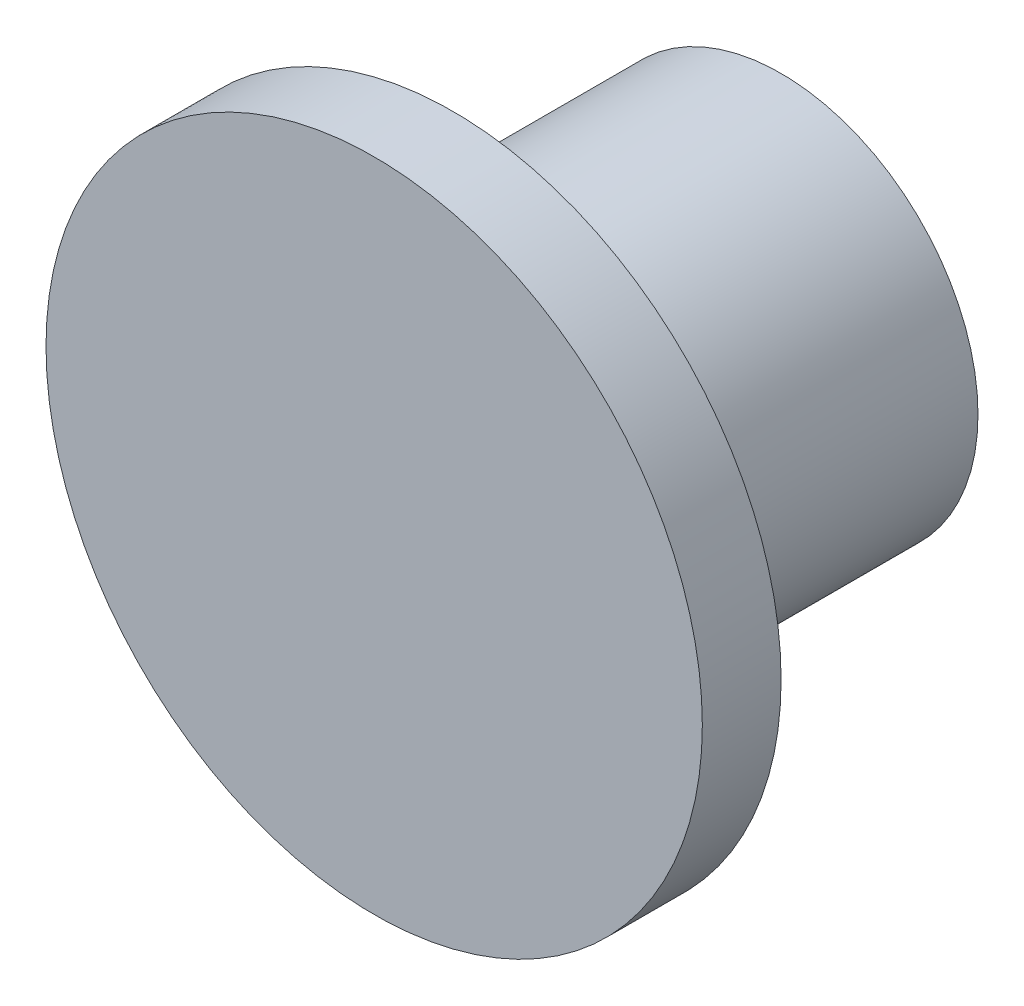
ISO-10303-21;
HEADER;
FILE_DESCRIPTION(('STEP AP214'),'2;1');
FILE_NAME('part.step','',(''),(''),'','','');
FILE_SCHEMA(('AUTOMOTIVE_DESIGN { 1 0 10303 214 1 1 1 1 }'));
ENDSEC;
DATA;
#1=APPLICATION_CONTEXT('core data for automotive mechanical design processes');
#2=APPLICATION_PROTOCOL_DEFINITION('international standard','automotive_design',2000,#1);
#3=PRODUCT_CONTEXT('',#1,'mechanical');
#4=PRODUCT('Part','Part','',(#3));
#5=PRODUCT_RELATED_PRODUCT_CATEGORY('part','',(#4));
#6=PRODUCT_DEFINITION_FORMATION('','',#4);
#7=PRODUCT_DEFINITION_CONTEXT('part definition',#1,'design');
#8=PRODUCT_DEFINITION('design','',#6,#7);
#9=PRODUCT_DEFINITION_SHAPE('','',#8);
#10=(LENGTH_UNIT() NAMED_UNIT(*) SI_UNIT(.MILLI.,.METRE.));
#11=(NAMED_UNIT(*) PLANE_ANGLE_UNIT() SI_UNIT($,.RADIAN.));
#12=(NAMED_UNIT(*) SI_UNIT($,.STERADIAN.) SOLID_ANGLE_UNIT());
#13=UNCERTAINTY_MEASURE_WITH_UNIT(LENGTH_MEASURE(1.E-05),#10,'distance_accuracy_value','');
#14=(GEOMETRIC_REPRESENTATION_CONTEXT(3) GLOBAL_UNCERTAINTY_ASSIGNED_CONTEXT((#13)) GLOBAL_UNIT_ASSIGNED_CONTEXT((#10,
#11,#12)) REPRESENTATION_CONTEXT('',''));
#15=CARTESIAN_POINT('',(0.,0.,0.));
#16=DIRECTION('',(0.,0.,1.));
#17=DIRECTION('',(1.,0.,0.));
#18=AXIS2_PLACEMENT_3D('',#15,#16,#17);
#19=CARTESIAN_POINT('',(0.,0.,31.75));
#20=DIRECTION('',(0.,0.,-1.));
#21=DIRECTION('',(-1.,0.,0.));
#22=AXIS2_PLACEMENT_3D('',#19,#20,#21);
#23=CYLINDRICAL_SURFACE('',#22,19.05);
#24=CARTESIAN_POINT('',(0.,0.,31.75));
#25=DIRECTION('',(0.,0.,1.));
#26=DIRECTION('',(1.,0.,0.));
#27=AXIS2_PLACEMENT_3D('',#24,#25,#26);
#28=CIRCLE('',#27,19.05);
#29=CARTESIAN_POINT('',(19.05,0.,31.75));
#30=VERTEX_POINT('',#29);
#31=EDGE_CURVE('E10',#30,#30,#28,.T.);
#32=ORIENTED_EDGE('',*,*,#31,.F.);
#33=EDGE_LOOP('',(#32));
#34=FACE_BOUND('',#33,.T.);
#35=CARTESIAN_POINT('',(0.,0.,0.));
#36=DIRECTION('',(0.,0.,1.));
#37=DIRECTION('',(1.,0.,0.));
#38=AXIS2_PLACEMENT_3D('',#35,#36,#37);
#39=CIRCLE('',#38,19.05);
#40=CARTESIAN_POINT('',(19.05,0.,0.));
#41=VERTEX_POINT('',#40);
#42=EDGE_CURVE('E37',#41,#41,#39,.T.);
#43=ORIENTED_EDGE('',*,*,#42,.T.);
#44=EDGE_LOOP('',(#43));
#45=FACE_BOUND('',#44,.T.);
#46=ADVANCED_FACE('F34',(#34,#45),#23,.T.);
#47=CARTESIAN_POINT('',(0.,0.,0.));
#48=DIRECTION('',(0.,0.,1.));
#49=DIRECTION('',(1.,0.,0.));
#50=AXIS2_PLACEMENT_3D('',#47,#48,#49);
#51=PLANE('',#50);
#52=ORIENTED_EDGE('',*,*,#42,.F.);
#53=EDGE_LOOP('',(#52));
#54=FACE_BOUND('',#53,.T.);
#55=ADVANCED_FACE('F57',(#54),#51,.F.);
#56=CARTESIAN_POINT('',(0.,0.,39.37));
#57=DIRECTION('',(0.,0.,-1.));
#58=DIRECTION('',(-1.,0.,0.));
#59=AXIS2_PLACEMENT_3D('',#56,#57,#58);
#60=CYLINDRICAL_SURFACE('',#59,31.75);
#61=CARTESIAN_POINT('',(0.,0.,39.37));
#62=DIRECTION('',(0.,0.,1.));
#63=DIRECTION('',(1.,0.,0.));
#64=AXIS2_PLACEMENT_3D('',#61,#62,#63);
#65=CIRCLE('',#64,31.75);
#66=CARTESIAN_POINT('',(-31.75,0.,39.37));
#67=VERTEX_POINT('',#66);
#68=EDGE_CURVE('E44',#67,#67,#65,.T.);
#69=CARTESIAN_POINT('',(0.,0.,31.75));
#70=DIRECTION('',(0.,0.,1.));
#71=DIRECTION('',(1.,0.,0.));
#72=AXIS2_PLACEMENT_3D('',#69,#70,#71);
#73=CIRCLE('',#72,31.75);
#74=CARTESIAN_POINT('',(-31.75,0.,31.75));
#75=VERTEX_POINT('',#74);
#76=EDGE_CURVE('E46',#75,#75,#73,.T.);
#77=CARTESIAN_POINT('',(-31.75,0.,39.37));
#78=CARTESIAN_POINT('',(-31.75,0.,39.290625));
#79=CARTESIAN_POINT('',(-31.75,0.,39.21125));
#80=CARTESIAN_POINT('',(-31.75,0.,39.0525));
#81=CARTESIAN_POINT('',(-31.75,0.,38.973125));
#82=CARTESIAN_POINT('',(-31.75,0.,38.814375));
#83=CARTESIAN_POINT('',(-31.75,0.,38.735));
#84=CARTESIAN_POINT('',(-31.75,0.,38.57625));
#85=CARTESIAN_POINT('',(-31.75,0.,38.496875));
#86=CARTESIAN_POINT('',(-31.75,0.,38.338125));
#87=CARTESIAN_POINT('',(-31.75,0.,38.25875));
#88=CARTESIAN_POINT('',(-31.75,0.,38.1));
#89=CARTESIAN_POINT('',(-31.75,0.,38.020625));
#90=CARTESIAN_POINT('',(-31.75,0.,37.861875));
#91=CARTESIAN_POINT('',(-31.75,0.,37.7825));
#92=CARTESIAN_POINT('',(-31.75,0.,37.62375));
#93=CARTESIAN_POINT('',(-31.75,0.,37.544375));
#94=CARTESIAN_POINT('',(-31.75,0.,37.385625));
#95=CARTESIAN_POINT('',(-31.75,0.,37.30625));
#96=CARTESIAN_POINT('',(-31.75,0.,37.1475));
#97=CARTESIAN_POINT('',(-31.75,0.,37.068125));
#98=CARTESIAN_POINT('',(-31.75,0.,36.909375));
#99=CARTESIAN_POINT('',(-31.75,0.,36.83));
#100=CARTESIAN_POINT('',(-31.75,0.,36.67125));
#101=CARTESIAN_POINT('',(-31.75,0.,36.591875));
#102=CARTESIAN_POINT('',(-31.75,0.,36.433125));
#103=CARTESIAN_POINT('',(-31.75,0.,36.35375));
#104=CARTESIAN_POINT('',(-31.75,0.,36.195));
#105=CARTESIAN_POINT('',(-31.75,0.,36.115625));
#106=CARTESIAN_POINT('',(-31.75,0.,35.956875));
#107=CARTESIAN_POINT('',(-31.75,0.,35.8775));
#108=CARTESIAN_POINT('',(-31.75,0.,35.71875));
#109=CARTESIAN_POINT('',(-31.75,0.,35.639375));
#110=CARTESIAN_POINT('',(-31.75,0.,35.480625));
#111=CARTESIAN_POINT('',(-31.75,0.,35.40125));
#112=CARTESIAN_POINT('',(-31.75,0.,35.2425));
#113=CARTESIAN_POINT('',(-31.75,0.,35.163125));
#114=CARTESIAN_POINT('',(-31.75,0.,35.004375));
#115=CARTESIAN_POINT('',(-31.75,0.,34.925));
#116=CARTESIAN_POINT('',(-31.75,0.,34.76625));
#117=CARTESIAN_POINT('',(-31.75,0.,34.686875));
#118=CARTESIAN_POINT('',(-31.75,0.,34.528125));
#119=CARTESIAN_POINT('',(-31.75,0.,34.44875));
#120=CARTESIAN_POINT('',(-31.75,0.,34.29));
#121=CARTESIAN_POINT('',(-31.75,0.,34.210625));
#122=CARTESIAN_POINT('',(-31.75,0.,34.051875));
#123=CARTESIAN_POINT('',(-31.75,0.,33.9725));
#124=CARTESIAN_POINT('',(-31.75,0.,33.81375));
#125=CARTESIAN_POINT('',(-31.75,0.,33.734375));
#126=CARTESIAN_POINT('',(-31.75,0.,33.575625));
#127=CARTESIAN_POINT('',(-31.75,0.,33.49625));
#128=CARTESIAN_POINT('',(-31.75,0.,33.3375));
#129=CARTESIAN_POINT('',(-31.75,0.,33.258125));
#130=CARTESIAN_POINT('',(-31.75,0.,33.099375));
#131=CARTESIAN_POINT('',(-31.75,0.,33.02));
#132=CARTESIAN_POINT('',(-31.75,0.,32.86125));
#133=CARTESIAN_POINT('',(-31.75,0.,32.781875));
#134=CARTESIAN_POINT('',(-31.75,0.,32.623125));
#135=CARTESIAN_POINT('',(-31.75,0.,32.54375));
#136=CARTESIAN_POINT('',(-31.75,0.,32.385));
#137=CARTESIAN_POINT('',(-31.75,0.,32.305625));
#138=CARTESIAN_POINT('',(-31.75,0.,32.146875));
#139=CARTESIAN_POINT('',(-31.75,0.,32.0675));
#140=CARTESIAN_POINT('',(-31.75,0.,31.90875));
#141=CARTESIAN_POINT('',(-31.75,0.,31.829375));
#142=CARTESIAN_POINT('',(-31.75,0.,31.75));
#143=B_SPLINE_CURVE_WITH_KNOTS('',3,(#77,#78,#79,#80,#81,#82,#83,#84,#85,#86,#87,#88,#89,#90,
#91,#92,#93,#94,#95,#96,#97,#98,#99,#100,#101,#102,#103,#104,#105,#106,#107,#108,#109,#110,#111,
#112,#113,#114,#115,#116,#117,#118,#119,#120,#121,#122,#123,#124,#125,#126,#127,#128,#129,#130,
#131,#132,#133,#134,#135,#136,#137,#138,#139,#140,#141,#142),.UNSPECIFIED.,.F.,.F.,(4,2,2,2,2,2,
2,2,2,2,2,2,2,2,2,2,2,2,2,2,2,2,2,2,2,2,2,2,2,2,2,2,4),(0.,0.238125000000006,0.476250000000004,
0.714375000000003,0.952500000000002,1.190625,1.42875000000001,1.66687500000001,1.905,2.143125,
2.38125,2.61937500000001,2.85750000000001,3.095625,3.33375,3.571875,3.81000000000001,
4.04812500000001,4.28625000000001,4.524375,4.7625,5.00062500000001,5.23875000000001,
5.47687500000001,5.71500000000001,5.953125,6.19125000000001,6.42937500000001,6.66750000000001,
6.90562500000001,7.14375,7.381875,7.62000000000001),.UNSPECIFIED.);
#144=EDGE_CURVE('BSEAM54',#67,#75,#143,.T.);
#145=ORIENTED_EDGE('',*,*,#68,.F.);
#146=ORIENTED_EDGE('',*,*,#76,.T.);
#147=ORIENTED_EDGE('',*,*,#144,.T.);
#148=ORIENTED_EDGE('',*,*,#144,.F.);
#149=EDGE_LOOP('',(#145,#147,#146,#148));
#150=FACE_BOUND('',#149,.T.);
#151=ADVANCED_FACE('F54',(#150),#60,.T.);
#152=CARTESIAN_POINT('',(0.,0.,39.37));
#153=DIRECTION('',(0.,0.,1.));
#154=DIRECTION('',(1.,0.,0.));
#155=AXIS2_PLACEMENT_3D('',#152,#153,#154);
#156=PLANE('',#155);
#157=ORIENTED_EDGE('',*,*,#68,.T.);
#158=EDGE_LOOP('',(#157));
#159=FACE_BOUND('',#158,.T.);
#160=ADVANCED_FACE('F52',(#159),#156,.T.);
#161=CARTESIAN_POINT('',(0.,0.,31.75));
#162=DIRECTION('',(0.,0.,1.));
#163=DIRECTION('',(1.,0.,0.));
#164=AXIS2_PLACEMENT_3D('',#161,#162,#163);
#165=PLANE('',#164);
#166=ORIENTED_EDGE('',*,*,#31,.T.);
#167=EDGE_LOOP('',(#166));
#168=FACE_BOUND('',#167,.T.);
#169=ORIENTED_EDGE('',*,*,#76,.F.);
#170=EDGE_LOOP('',(#169));
#171=FACE_BOUND('',#170,.T.);
#172=ADVANCED_FACE('F61',(#168,#171),#165,.F.);
#173=CLOSED_SHELL('',(#46,#55,#151,#160,#172));
#174=MANIFOLD_SOLID_BREP('B2',#173);
#175=ADVANCED_BREP_SHAPE_REPRESENTATION('',(#18,#174),#14);
#176=SHAPE_DEFINITION_REPRESENTATION(#9,#175);
ENDSEC;
END-ISO-10303-21;
